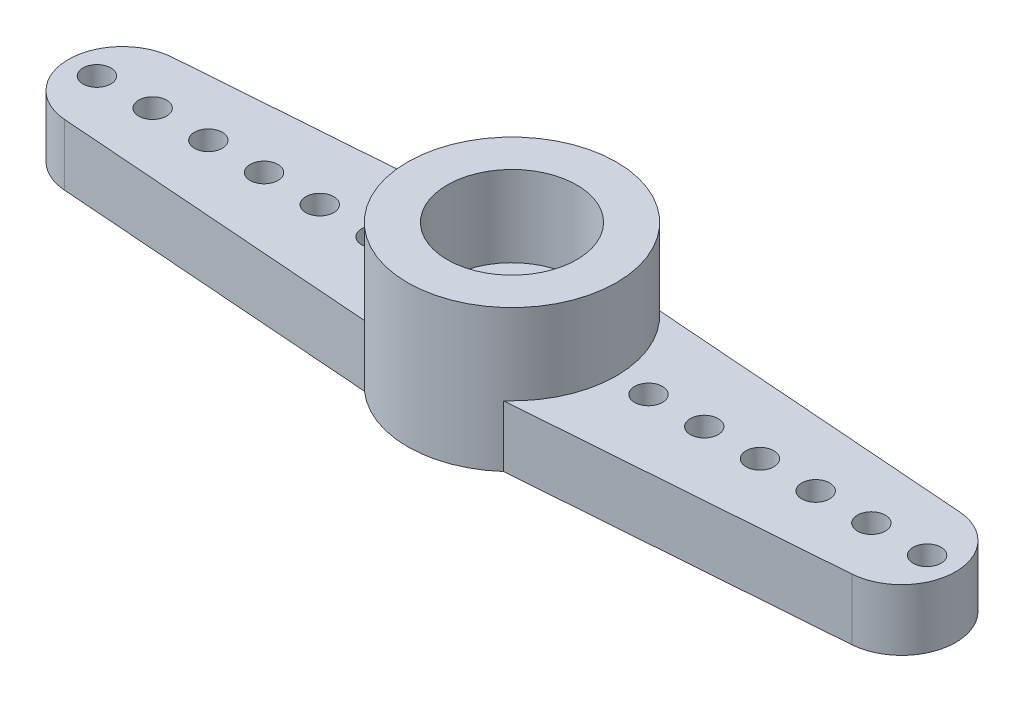
ISO-10303-21;
HEADER;
FILE_DESCRIPTION(('STEP AP214'),'2;1');
FILE_NAME('part.step','',(''),(''),'','','');
FILE_SCHEMA(('AUTOMOTIVE_DESIGN { 1 0 10303 214 1 1 1 1 }'));
ENDSEC;
DATA;
#1=APPLICATION_CONTEXT('core data for automotive mechanical design processes');
#2=APPLICATION_PROTOCOL_DEFINITION('international standard','automotive_design',2000,#1);
#3=PRODUCT_CONTEXT('',#1,'mechanical');
#4=PRODUCT('Part','Part','',(#3));
#5=PRODUCT_RELATED_PRODUCT_CATEGORY('part','',(#4));
#6=PRODUCT_DEFINITION_FORMATION('','',#4);
#7=PRODUCT_DEFINITION_CONTEXT('part definition',#1,'design');
#8=PRODUCT_DEFINITION('design','',#6,#7);
#9=PRODUCT_DEFINITION_SHAPE('','',#8);
#10=(LENGTH_UNIT() NAMED_UNIT(*) SI_UNIT(.MILLI.,.METRE.));
#11=(NAMED_UNIT(*) PLANE_ANGLE_UNIT() SI_UNIT($,.RADIAN.));
#12=(NAMED_UNIT(*) SI_UNIT($,.STERADIAN.) SOLID_ANGLE_UNIT());
#13=UNCERTAINTY_MEASURE_WITH_UNIT(LENGTH_MEASURE(1.E-05),#10,'distance_accuracy_value','');
#14=(GEOMETRIC_REPRESENTATION_CONTEXT(3) GLOBAL_UNCERTAINTY_ASSIGNED_CONTEXT((#13)) GLOBAL_UNIT_ASSIGNED_CONTEXT((#10,
#11,#12)) REPRESENTATION_CONTEXT('',''));
#15=CARTESIAN_POINT('',(0.,0.,0.));
#16=DIRECTION('',(0.,0.,1.));
#17=DIRECTION('',(1.,0.,0.));
#18=AXIS2_PLACEMENT_3D('',#15,#16,#17);
#19=CARTESIAN_POINT('',(0.,2.2,0.));
#20=DIRECTION('',(0.,-1.,0.));
#21=DIRECTION('',(0.,0.,-1.));
#22=AXIS2_PLACEMENT_3D('',#19,#20,#21);
#23=CYLINDRICAL_SURFACE('',#22,1.5);
#24=CARTESIAN_POINT('',(0.,2.2,0.));
#25=DIRECTION('',(0.,1.,0.));
#26=DIRECTION('',(0.,0.,1.));
#27=AXIS2_PLACEMENT_3D('',#24,#25,#26);
#28=CIRCLE('',#27,1.5);
#29=CARTESIAN_POINT('',(0.,2.2,1.5));
#30=VERTEX_POINT('',#29);
#31=EDGE_CURVE('E136',#30,#30,#28,.T.);
#32=ORIENTED_EDGE('',*,*,#31,.T.);
#33=EDGE_LOOP('',(#32));
#34=FACE_BOUND('',#33,.T.);
#35=CARTESIAN_POINT('',(0.,0.8,0.));
#36=DIRECTION('',(0.,-1.,0.));
#37=DIRECTION('',(0.,0.,-1.));
#38=AXIS2_PLACEMENT_3D('',#35,#36,#37);
#39=CIRCLE('',#38,1.5);
#40=CARTESIAN_POINT('',(0.,0.8,-1.5));
#41=VERTEX_POINT('',#40);
#42=EDGE_CURVE('E42',#41,#41,#39,.T.);
#43=ORIENTED_EDGE('',*,*,#42,.T.);
#44=EDGE_LOOP('',(#43));
#45=FACE_BOUND('',#44,.T.);
#46=ADVANCED_FACE('F35',(#34,#45),#23,.F.);
#47=CARTESIAN_POINT('',(14.1314068018781,2.42,-1.93230912585367));
#48=CARTESIAN_POINT('',(14.1314068018781,2.3466666666666,-1.93230912585367));
#49=CARTESIAN_POINT('',(14.1314068018783,2.27333333333342,-1.93230912585365));
#50=CARTESIAN_POINT('',(14.1314068018762,1.46666666666577,-1.93230912585381));
#51=CARTESIAN_POINT('',(14.1314068018781,0.733333333333381,-1.93230912585367));
#52=CARTESIAN_POINT('',(14.1314068018781,-0.0733333333333382,-1.93230912585367));
#53=CARTESIAN_POINT('',(14.1314068018781,-0.146666666666661,-1.93230912585367));
#54=CARTESIAN_POINT('',(14.1314068018781,-0.22,-1.93230912585367));
#55=CARTESIAN_POINT('',(17.4863916285294,2.42,-1.68214916068935));
#56=CARTESIAN_POINT('',(17.4863916285294,2.34666666666683,-1.68214916068935));
#57=CARTESIAN_POINT('',(17.4863916285292,2.27333333333312,-1.68214916068915));
#58=CARTESIAN_POINT('',(17.486391628532,1.4666666666688,-1.68214916069142));
#59=CARTESIAN_POINT('',(17.4863916285294,0.733333333333381,-1.68214916068935));
#60=CARTESIAN_POINT('',(17.4863916285294,-0.0733333333333382,-1.68214916068935));
#61=CARTESIAN_POINT('',(17.4863916285294,-0.146666666666661,-1.68214916068935));
#62=CARTESIAN_POINT('',(17.4863916285294,-0.22,-1.68214916068935));
#63=CARTESIAN_POINT('',(17.4863916285294,2.42,1.68214916068935));
#64=CARTESIAN_POINT('',(17.4863916285294,2.34666666666683,1.68214916068935));
#65=CARTESIAN_POINT('',(17.4863916285292,2.27333333333312,1.68214916068916));
#66=CARTESIAN_POINT('',(17.486391628532,1.4666666666688,1.68214916069134));
#67=CARTESIAN_POINT('',(17.4863916285294,0.733333333333381,1.68214916068935));
#68=CARTESIAN_POINT('',(17.4863916285294,-0.0733333333333382,1.68214916068935));
#69=CARTESIAN_POINT('',(17.4863916285294,-0.146666666666661,1.68214916068935));
#70=CARTESIAN_POINT('',(17.4863916285294,-0.22,1.68214916068935));
#71=CARTESIAN_POINT('',(14.1314068018781,2.42,1.93230912585367));
#72=CARTESIAN_POINT('',(14.1314068018781,2.3466666666666,1.93230912585367));
#73=CARTESIAN_POINT('',(14.1314068018783,2.27333333333342,1.93230912585365));
#74=CARTESIAN_POINT('',(14.1314068018762,1.46666666666577,1.93230912585381));
#75=CARTESIAN_POINT('',(14.1314068018781,0.733333333333381,1.93230912585367));
#76=CARTESIAN_POINT('',(14.1314068018781,-0.0733333333333382,1.93230912585367));
#77=CARTESIAN_POINT('',(14.1314068018781,-0.146666666666661,1.93230912585367));
#78=CARTESIAN_POINT('',(14.1314068018781,-0.22,1.93230912585367));
#79=(BOUNDED_SURFACE() B_SPLINE_SURFACE(3,3,((#47,#48,#49,#50,#51,#52,#53,#54),(#55,#56,#57,#58,
#59,#60,#61,#62),(#63,#64,#65,#66,#67,#68,#69,#70),(#71,#72,#73,#74,#75,#76,#77,#78)),
.UNSPECIFIED.,.F.,.F.,.F.) B_SPLINE_SURFACE_WITH_KNOTS((4,4),(4,2,2,4),(0.,1.),(-0.1,0.,1.,1.1),
.UNSPECIFIED.) GEOMETRIC_REPRESENTATION_ITEM() RATIONAL_B_SPLINE_SURFACE(((1.,1.,1.,1.,1.,1.,1.,
1.),(0.382904832106128,0.382904832106128,0.382904832106128,0.382904832106128,0.382904832106128,
0.382904832106128,0.382904832106128,0.382904832106128),(0.382904832106128,0.382904832106128,
0.382904832106128,0.382904832106128,0.382904832106128,0.382904832106128,0.382904832106128,
0.382904832106128),(1.,1.,1.,1.,1.,1.,1.,1.))) REPRESENTATION_ITEM('') SURFACE());
#80=CARTESIAN_POINT('',(14.1314068018781,-0.22,-1.93230912585367));
#81=CARTESIAN_POINT('',(14.1314068018781,-0.146666666666661,-1.93230912585367));
#82=CARTESIAN_POINT('',(14.1314068018781,-0.0733333333333382,-1.93230912585367));
#83=CARTESIAN_POINT('',(14.1314068018781,0.733333333333381,-1.93230912585367));
#84=CARTESIAN_POINT('',(14.1314068018762,1.46666666666577,-1.93230912585381));
#85=CARTESIAN_POINT('',(14.1314068018783,2.27333333333342,-1.93230912585365));
#86=CARTESIAN_POINT('',(14.1314068018781,2.3466666666666,-1.93230912585367));
#87=CARTESIAN_POINT('',(14.1314068018781,2.42,-1.93230912585367));
#88=(BOUNDED_CURVE() B_SPLINE_CURVE(3,(#80,#81,#82,#83,#84,#85,#86,#87),.UNSPECIFIED.,.F.,
.F.) B_SPLINE_CURVE_WITH_KNOTS((4,2,2,4),(-0.1,0.,1.,1.1),
.UNSPECIFIED.) CURVE() GEOMETRIC_REPRESENTATION_ITEM() RATIONAL_B_SPLINE_CURVE((1.,1.,1.,1.,1.,
1.,1.,1.)) REPRESENTATION_ITEM(''));
#89=CARTESIAN_POINT('',(14.1314068018781,2.2,-1.93230912585367));
#90=VERTEX_POINT('',#89);
#91=CARTESIAN_POINT('',(14.1314068018781,0.,-1.93230912585367));
#92=VERTEX_POINT('',#91);
#93=EDGE_CURVE('E275',#90,#92,#88,.F.);
#94=CARTESIAN_POINT('',(14.1314068018781,2.2,-1.93230912585367));
#95=CARTESIAN_POINT('',(17.4863916285294,2.2,-1.68214916068935));
#96=CARTESIAN_POINT('',(17.4863916285294,2.2,1.68214916068936));
#97=CARTESIAN_POINT('',(14.1314068018781,2.2,1.93230912585367));
#98=(BOUNDED_CURVE() B_SPLINE_CURVE(3,(#94,#95,#96,#97),.UNSPECIFIED.,.F.,
.F.) B_SPLINE_CURVE_WITH_KNOTS((4,4),(0.,1.),
.UNSPECIFIED.) CURVE() GEOMETRIC_REPRESENTATION_ITEM() RATIONAL_B_SPLINE_CURVE((1.,
0.382904832106128,0.382904832106128,1.)) REPRESENTATION_ITEM(''));
#99=CARTESIAN_POINT('',(14.1314068018781,2.2,1.93230912585367));
#100=VERTEX_POINT('',#99);
#101=EDGE_CURVE('E47',#100,#90,#98,.F.);
#102=CARTESIAN_POINT('',(14.1314068018781,2.42,1.93230912585367));
#103=CARTESIAN_POINT('',(14.1314068018781,2.3466666666666,1.93230912585367));
#104=CARTESIAN_POINT('',(14.1314068018783,2.27333333333342,1.93230912585365));
#105=CARTESIAN_POINT('',(14.1314068018762,1.46666666666577,1.93230912585381));
#106=CARTESIAN_POINT('',(14.1314068018781,0.733333333333381,1.93230912585367));
#107=CARTESIAN_POINT('',(14.1314068018781,-0.0733333333333382,1.93230912585367));
#108=CARTESIAN_POINT('',(14.1314068018781,-0.146666666666661,1.93230912585367));
#109=CARTESIAN_POINT('',(14.1314068018781,-0.22,1.93230912585367));
#110=(BOUNDED_CURVE() B_SPLINE_CURVE(3,(#102,#103,#104,#105,#106,#107,#108,#109),.UNSPECIFIED.,
.F.,.F.) B_SPLINE_CURVE_WITH_KNOTS((4,2,2,4),(-0.1,0.,1.,1.1),
.UNSPECIFIED.) CURVE() GEOMETRIC_REPRESENTATION_ITEM() RATIONAL_B_SPLINE_CURVE((1.,1.,1.,1.,1.,
1.,1.,1.)) REPRESENTATION_ITEM(''));
#111=CARTESIAN_POINT('',(14.1314068018781,0.,1.93230912585367));
#112=VERTEX_POINT('',#111);
#113=EDGE_CURVE('E109',#112,#100,#110,.F.);
#114=CARTESIAN_POINT('',(14.1314068018781,0.,1.93230912585367));
#115=CARTESIAN_POINT('',(17.4863916285294,0.,1.68214916068935));
#116=CARTESIAN_POINT('',(17.4863916285294,0.,-1.68214916068935));
#117=CARTESIAN_POINT('',(14.1314068018781,0.,-1.93230912585367));
#118=(BOUNDED_CURVE() B_SPLINE_CURVE(3,(#114,#115,#116,#117),.UNSPECIFIED.,.F.,
.F.) B_SPLINE_CURVE_WITH_KNOTS((4,4),(0.,1.),
.UNSPECIFIED.) CURVE() GEOMETRIC_REPRESENTATION_ITEM() RATIONAL_B_SPLINE_CURVE((1.,
0.382904832106128,0.382904832106128,1.)) REPRESENTATION_ITEM(''));
#119=EDGE_CURVE('E11',#92,#112,#118,.F.);
#120=ORIENTED_EDGE('',*,*,#93,.F.);
#121=ORIENTED_EDGE('',*,*,#101,.F.);
#122=ORIENTED_EDGE('',*,*,#113,.F.);
#123=ORIENTED_EDGE('',*,*,#119,.F.);
#124=EDGE_LOOP('',(#120,#121,#122,#123));
#125=FACE_BOUND('',#124,.T.);
#126=ADVANCED_FACE('F37',(#125),#79,.T.);
#127=CARTESIAN_POINT('',(-14.1314068018781,2.42,1.93230912585367));
#128=CARTESIAN_POINT('',(-14.1314068018781,2.3466666666666,1.93230912585367));
#129=CARTESIAN_POINT('',(-14.1314068018783,2.27333333333342,1.93230912585365));
#130=CARTESIAN_POINT('',(-14.1314068018762,1.46666666666577,1.93230912585381));
#131=CARTESIAN_POINT('',(-14.1314068018781,0.733333333333381,1.93230912585367));
#132=CARTESIAN_POINT('',(-14.1314068018781,-0.0733333333333382,1.93230912585367));
#133=CARTESIAN_POINT('',(-14.1314068018781,-0.146666666666661,1.93230912585367));
#134=CARTESIAN_POINT('',(-14.1314068018781,-0.22,1.93230912585367));
#135=CARTESIAN_POINT('',(-17.4863916285294,2.42,1.68214916068935));
#136=CARTESIAN_POINT('',(-17.4863916285294,2.34666666666683,1.68214916068935));
#137=CARTESIAN_POINT('',(-17.4863916285292,2.27333333333312,1.68214916068916));
#138=CARTESIAN_POINT('',(-17.486391628532,1.4666666666688,1.68214916069134));
#139=CARTESIAN_POINT('',(-17.4863916285294,0.733333333333381,1.68214916068935));
#140=CARTESIAN_POINT('',(-17.4863916285294,-0.0733333333333382,1.68214916068935));
#141=CARTESIAN_POINT('',(-17.4863916285294,-0.146666666666661,1.68214916068935));
#142=CARTESIAN_POINT('',(-17.4863916285294,-0.22,1.68214916068935));
#143=CARTESIAN_POINT('',(-17.4863916285294,2.42,-1.68214916068935));
#144=CARTESIAN_POINT('',(-17.4863916285294,2.34666666666683,-1.68214916068935));
#145=CARTESIAN_POINT('',(-17.486391628529,2.27333333333312,-1.68214916068916));
#146=CARTESIAN_POINT('',(-17.4863916285332,1.4666666666688,-1.68214916069134));
#147=CARTESIAN_POINT('',(-17.4863916285294,0.733333333333381,-1.68214916068935));
#148=CARTESIAN_POINT('',(-17.4863916285294,-0.0733333333333382,-1.68214916068935));
#149=CARTESIAN_POINT('',(-17.4863916285294,-0.146666666666661,-1.68214916068935));
#150=CARTESIAN_POINT('',(-17.4863916285294,-0.22,-1.68214916068935));
#151=CARTESIAN_POINT('',(-14.1314068018781,2.42,-1.93230912585367));
#152=CARTESIAN_POINT('',(-14.1314068018781,2.3466666666666,-1.93230912585367));
#153=CARTESIAN_POINT('',(-14.1314068018783,2.27333333333342,-1.93230912585365));
#154=CARTESIAN_POINT('',(-14.1314068018762,1.46666666666577,-1.93230912585381));
#155=CARTESIAN_POINT('',(-14.1314068018781,0.733333333333381,-1.93230912585367));
#156=CARTESIAN_POINT('',(-14.1314068018781,-0.0733333333333382,-1.93230912585367));
#157=CARTESIAN_POINT('',(-14.1314068018781,-0.146666666666661,-1.93230912585367));
#158=CARTESIAN_POINT('',(-14.1314068018781,-0.22,-1.93230912585367));
#159=(BOUNDED_SURFACE() B_SPLINE_SURFACE(3,3,((#127,#128,#129,#130,#131,#132,#133,#134),(#135,
#136,#137,#138,#139,#140,#141,#142),(#143,#144,#145,#146,#147,#148,#149,#150),(#151,#152,#153,
#154,#155,#156,#157,#158)),.UNSPECIFIED.,.F.,.F.,.F.) B_SPLINE_SURFACE_WITH_KNOTS((4,4),(4,2,2,
4),(0.,1.),(-0.1,0.,1.,1.1),
.UNSPECIFIED.) GEOMETRIC_REPRESENTATION_ITEM() RATIONAL_B_SPLINE_SURFACE(((1.,1.,1.,1.,1.,1.,1.,
1.),(0.382904832106128,0.382904832106128,0.382904832106128,0.382904832106128,0.382904832106128,
0.382904832106128,0.382904832106128,0.382904832106128),(0.382904832106128,0.382904832106128,
0.382904832106128,0.382904832106128,0.382904832106128,0.382904832106128,0.382904832106128,
0.382904832106128),(1.,1.,1.,1.,1.,1.,1.,1.))) REPRESENTATION_ITEM('') SURFACE());
#160=CARTESIAN_POINT('',(-14.1314068018781,2.42,-1.93230912585367));
#161=CARTESIAN_POINT('',(-14.1314068018781,2.3466666666666,-1.93230912585367));
#162=CARTESIAN_POINT('',(-14.1314068018783,2.27333333333342,-1.93230912585365));
#163=CARTESIAN_POINT('',(-14.1314068018762,1.46666666666577,-1.93230912585381));
#164=CARTESIAN_POINT('',(-14.1314068018781,0.733333333333381,-1.93230912585367));
#165=CARTESIAN_POINT('',(-14.1314068018781,-0.0733333333333382,-1.93230912585367));
#166=CARTESIAN_POINT('',(-14.1314068018781,-0.146666666666661,-1.93230912585367));
#167=CARTESIAN_POINT('',(-14.1314068018781,-0.22,-1.93230912585367));
#168=(BOUNDED_CURVE() B_SPLINE_CURVE(3,(#160,#161,#162,#163,#164,#165,#166,#167),.UNSPECIFIED.,
.F.,.F.) B_SPLINE_CURVE_WITH_KNOTS((4,2,2,4),(-0.1,0.,1.,1.1),
.UNSPECIFIED.) CURVE() GEOMETRIC_REPRESENTATION_ITEM() RATIONAL_B_SPLINE_CURVE((1.,1.,1.,1.,1.,
1.,1.,1.)) REPRESENTATION_ITEM(''));
#169=CARTESIAN_POINT('',(-14.1314068018781,0.,-1.93230912585367));
#170=VERTEX_POINT('',#169);
#171=CARTESIAN_POINT('',(-14.1314068018781,2.2,-1.93230912585367));
#172=VERTEX_POINT('',#171);
#173=EDGE_CURVE('E156',#170,#172,#168,.F.);
#174=CARTESIAN_POINT('',(-14.1314068018781,0.,-1.93230912585367));
#175=CARTESIAN_POINT('',(-17.4863916285294,0.,-1.68214916068935));
#176=CARTESIAN_POINT('',(-17.4863916285294,0.,1.68214916068935));
#177=CARTESIAN_POINT('',(-14.1314068018781,0.,1.93230912585367));
#178=(BOUNDED_CURVE() B_SPLINE_CURVE(3,(#174,#175,#176,#177),.UNSPECIFIED.,.F.,
.F.) B_SPLINE_CURVE_WITH_KNOTS((4,4),(0.,1.),
.UNSPECIFIED.) CURVE() GEOMETRIC_REPRESENTATION_ITEM() RATIONAL_B_SPLINE_CURVE((1.,
0.382904832106128,0.382904832106128,1.)) REPRESENTATION_ITEM(''));
#179=CARTESIAN_POINT('',(-14.1314068018781,0.,1.93230912585367));
#180=VERTEX_POINT('',#179);
#181=EDGE_CURVE('E483',#180,#170,#178,.F.);
#182=CARTESIAN_POINT('',(-14.1314068018781,-0.22,1.93230912585367));
#183=CARTESIAN_POINT('',(-14.1314068018781,-0.146666666666661,1.93230912585367));
#184=CARTESIAN_POINT('',(-14.1314068018781,-0.0733333333333382,1.93230912585367));
#185=CARTESIAN_POINT('',(-14.1314068018781,0.733333333333381,1.93230912585367));
#186=CARTESIAN_POINT('',(-14.1314068018762,1.46666666666577,1.93230912585381));
#187=CARTESIAN_POINT('',(-14.1314068018783,2.27333333333342,1.93230912585365));
#188=CARTESIAN_POINT('',(-14.1314068018781,2.3466666666666,1.93230912585367));
#189=CARTESIAN_POINT('',(-14.1314068018781,2.42,1.93230912585367));
#190=(BOUNDED_CURVE() B_SPLINE_CURVE(3,(#182,#183,#184,#185,#186,#187,#188,#189),.UNSPECIFIED.,
.F.,.F.) B_SPLINE_CURVE_WITH_KNOTS((4,2,2,4),(-0.1,0.,1.,1.1),
.UNSPECIFIED.) CURVE() GEOMETRIC_REPRESENTATION_ITEM() RATIONAL_B_SPLINE_CURVE((1.,1.,1.,1.,1.,
1.,1.,1.)) REPRESENTATION_ITEM(''));
#191=CARTESIAN_POINT('',(-14.1314068018781,2.2,1.93230912585367));
#192=VERTEX_POINT('',#191);
#193=EDGE_CURVE('E174',#192,#180,#190,.F.);
#194=CARTESIAN_POINT('',(-14.1314068018781,2.2,1.93230912585367));
#195=CARTESIAN_POINT('',(-17.4863916285294,2.2,1.68214916068935));
#196=CARTESIAN_POINT('',(-17.4863916285294,2.2,-1.68214916068935));
#197=CARTESIAN_POINT('',(-14.1314068018781,2.2,-1.93230912585367));
#198=(BOUNDED_CURVE() B_SPLINE_CURVE(3,(#194,#195,#196,#197),.UNSPECIFIED.,.F.,
.F.) B_SPLINE_CURVE_WITH_KNOTS((4,4),(0.,1.),
.UNSPECIFIED.) CURVE() GEOMETRIC_REPRESENTATION_ITEM() RATIONAL_B_SPLINE_CURVE((1.,
0.382904832106128,0.382904832106128,1.)) REPRESENTATION_ITEM(''));
#199=EDGE_CURVE('E308',#172,#192,#198,.F.);
#200=ORIENTED_EDGE('',*,*,#173,.F.);
#201=ORIENTED_EDGE('',*,*,#181,.F.);
#202=ORIENTED_EDGE('',*,*,#193,.F.);
#203=ORIENTED_EDGE('',*,*,#199,.F.);
#204=EDGE_LOOP('',(#200,#201,#202,#203));
#205=FACE_BOUND('',#204,.T.);
#206=ADVANCED_FACE('F197',(#205),#159,.T.);
#207=CARTESIAN_POINT('',(0.,2.2,0.));
#208=DIRECTION('',(0.,1.,0.));
#209=DIRECTION('',(0.,0.,1.));
#210=AXIS2_PLACEMENT_3D('',#207,#208,#209);
#211=PLANE('',#210);
#212=DIRECTION('',(0.997231667992043,0.,-0.0743572481591926));
#213=VECTOR('',#212,1.);
#214=CARTESIAN_POINT('',(2.49449393665328,2.2,2.8));
#215=LINE('',#214,#213);
#216=CARTESIAN_POINT('',(2.49449393665328,2.2,2.8));
#217=VERTEX_POINT('',#216);
#218=EDGE_CURVE('E104',#217,#100,#215,.T.);
#219=ORIENTED_EDGE('',*,*,#218,.T.);
#220=ORIENTED_EDGE('',*,*,#101,.T.);
#221=DIRECTION('',(-0.997231667992043,0.,-0.0743572481591926));
#222=VECTOR('',#221,1.);
#223=CARTESIAN_POINT('',(2.49449393665328,2.2,-2.8));
#224=LINE('',#223,#222);
#225=CARTESIAN_POINT('',(2.49449393665328,2.2,-2.8));
#226=VERTEX_POINT('',#225);
#227=EDGE_CURVE('E113',#90,#226,#224,.T.);
#228=ORIENTED_EDGE('',*,*,#227,.T.);
#229=CARTESIAN_POINT('',(0.,2.2,0.));
#230=DIRECTION('',(0.,1.,0.));
#231=DIRECTION('',(0.,0.,1.));
#232=AXIS2_PLACEMENT_3D('',#229,#230,#231);
#233=CIRCLE('',#232,3.75);
#234=EDGE_CURVE('E121',#217,#226,#233,.T.);
#235=ORIENTED_EDGE('',*,*,#234,.F.);
#236=EDGE_LOOP('',(#219,#220,#228,#235));
#237=FACE_BOUND('',#236,.T.);
#238=CARTESIAN_POINT('',(12.9,2.2,0.));
#239=DIRECTION('',(0.,1.,0.));
#240=DIRECTION('',(0.,0.,1.));
#241=AXIS2_PLACEMENT_3D('',#238,#239,#240);
#242=CIRCLE('',#241,0.500000000000001);
#243=CARTESIAN_POINT('',(12.9,2.2,0.500000000000001));
#244=VERTEX_POINT('',#243);
#245=EDGE_CURVE('E350',#244,#244,#242,.T.);
#246=ORIENTED_EDGE('',*,*,#245,.F.);
#247=EDGE_LOOP('',(#246));
#248=FACE_BOUND('',#247,.T.);
#249=CARTESIAN_POINT('',(8.9,2.2,0.));
#250=DIRECTION('',(0.,1.,0.));
#251=DIRECTION('',(0.,0.,1.));
#252=AXIS2_PLACEMENT_3D('',#249,#250,#251);
#253=CIRCLE('',#252,0.500000000000001);
#254=CARTESIAN_POINT('',(8.9,2.2,0.500000000000001));
#255=VERTEX_POINT('',#254);
#256=EDGE_CURVE('E338',#255,#255,#253,.T.);
#257=ORIENTED_EDGE('',*,*,#256,.F.);
#258=EDGE_LOOP('',(#257));
#259=FACE_BOUND('',#258,.T.);
#260=CARTESIAN_POINT('',(4.9,2.2,0.));
#261=DIRECTION('',(0.,1.,0.));
#262=DIRECTION('',(0.,0.,1.));
#263=AXIS2_PLACEMENT_3D('',#260,#261,#262);
#264=CIRCLE('',#263,0.500000000000001);
#265=CARTESIAN_POINT('',(4.9,2.2,0.500000000000001));
#266=VERTEX_POINT('',#265);
#267=EDGE_CURVE('E326',#266,#266,#264,.T.);
#268=ORIENTED_EDGE('',*,*,#267,.F.);
#269=EDGE_LOOP('',(#268));
#270=FACE_BOUND('',#269,.T.);
#271=CARTESIAN_POINT('',(6.9,2.2,0.));
#272=DIRECTION('',(0.,1.,0.));
#273=DIRECTION('',(0.,0.,1.));
#274=AXIS2_PLACEMENT_3D('',#271,#272,#273);
#275=CIRCLE('',#274,0.500000000000001);
#276=CARTESIAN_POINT('',(6.9,2.2,0.500000000000001));
#277=VERTEX_POINT('',#276);
#278=EDGE_CURVE('E333',#277,#277,#275,.T.);
#279=ORIENTED_EDGE('',*,*,#278,.F.);
#280=EDGE_LOOP('',(#279));
#281=FACE_BOUND('',#280,.T.);
#282=CARTESIAN_POINT('',(10.9,2.2,0.));
#283=DIRECTION('',(0.,1.,0.));
#284=DIRECTION('',(0.,0.,1.));
#285=AXIS2_PLACEMENT_3D('',#282,#283,#284);
#286=CIRCLE('',#285,0.500000000000001);
#287=CARTESIAN_POINT('',(10.9,2.2,0.500000000000001));
#288=VERTEX_POINT('',#287);
#289=EDGE_CURVE('E344',#288,#288,#286,.T.);
#290=ORIENTED_EDGE('',*,*,#289,.F.);
#291=EDGE_LOOP('',(#290));
#292=FACE_BOUND('',#291,.T.);
#293=CARTESIAN_POINT('',(14.9,2.2,0.));
#294=DIRECTION('',(0.,1.,0.));
#295=DIRECTION('',(0.,0.,1.));
#296=AXIS2_PLACEMENT_3D('',#293,#294,#295);
#297=CIRCLE('',#296,0.500000000000001);
#298=CARTESIAN_POINT('',(14.9,2.2,0.500000000000001));
#299=VERTEX_POINT('',#298);
#300=EDGE_CURVE('E356',#299,#299,#297,.T.);
#301=ORIENTED_EDGE('',*,*,#300,.F.);
#302=EDGE_LOOP('',(#301));
#303=FACE_BOUND('',#302,.T.);
#304=ADVANCED_FACE('F128',(#237,#248,#259,#270,#281,#292,#303),#211,.T.);
#305=ORIENTED_EDGE('',*,*,#31,.F.);
#306=EDGE_LOOP('',(#305));
#307=FACE_BOUND('',#306,.T.);
#308=CARTESIAN_POINT('',(0.,2.2,0.));
#309=DIRECTION('',(0.,1.,0.));
#310=DIRECTION('',(0.,0.,1.));
#311=AXIS2_PLACEMENT_3D('',#308,#309,#310);
#312=CIRCLE('',#311,2.325);
#313=CARTESIAN_POINT('',(0.,2.2,2.325));
#314=VERTEX_POINT('',#313);
#315=EDGE_CURVE('E139',#314,#314,#312,.T.);
#316=ORIENTED_EDGE('',*,*,#315,.T.);
#317=EDGE_LOOP('',(#316));
#318=FACE_BOUND('',#317,.T.);
#319=ADVANCED_FACE('F405',(#307,#318),#211,.T.);
#320=DIRECTION('',(-0.997231667992043,0.,0.0743572481591926));
#321=VECTOR('',#320,1.);
#322=CARTESIAN_POINT('',(-2.49449393665328,2.2,-2.8));
#323=LINE('',#322,#321);
#324=CARTESIAN_POINT('',(-2.49449393665328,2.2,-2.8));
#325=VERTEX_POINT('',#324);
#326=EDGE_CURVE('E165',#325,#172,#323,.T.);
#327=ORIENTED_EDGE('',*,*,#326,.T.);
#328=ORIENTED_EDGE('',*,*,#199,.T.);
#329=DIRECTION('',(0.997231667992043,0.,0.0743572481591926));
#330=VECTOR('',#329,1.);
#331=CARTESIAN_POINT('',(-2.49449393665328,2.2,2.8));
#332=LINE('',#331,#330);
#333=CARTESIAN_POINT('',(-2.49449393665328,2.2,2.8));
#334=VERTEX_POINT('',#333);
#335=EDGE_CURVE('E114',#192,#334,#332,.T.);
#336=ORIENTED_EDGE('',*,*,#335,.T.);
#337=EDGE_CURVE('E152',#325,#334,#233,.T.);
#338=ORIENTED_EDGE('',*,*,#337,.F.);
#339=EDGE_LOOP('',(#327,#328,#336,#338));
#340=FACE_BOUND('',#339,.T.);
#341=CARTESIAN_POINT('',(-4.9,2.2,0.));
#342=DIRECTION('',(0.,1.,0.));
#343=DIRECTION('',(0.,0.,-1.));
#344=AXIS2_PLACEMENT_3D('',#341,#342,#343);
#345=CIRCLE('',#344,0.500000000000001);
#346=CARTESIAN_POINT('',(-4.9,2.2,-0.500000000000001));
#347=VERTEX_POINT('',#346);
#348=EDGE_CURVE('E392',#347,#347,#345,.T.);
#349=ORIENTED_EDGE('',*,*,#348,.F.);
#350=EDGE_LOOP('',(#349));
#351=FACE_BOUND('',#350,.T.);
#352=CARTESIAN_POINT('',(-8.9,2.2,0.));
#353=DIRECTION('',(0.,1.,0.));
#354=DIRECTION('',(0.,0.,-1.));
#355=AXIS2_PLACEMENT_3D('',#352,#353,#354);
#356=CIRCLE('',#355,0.500000000000001);
#357=CARTESIAN_POINT('',(-8.9,2.2,-0.500000000000001));
#358=VERTEX_POINT('',#357);
#359=EDGE_CURVE('E380',#358,#358,#356,.T.);
#360=ORIENTED_EDGE('',*,*,#359,.F.);
#361=EDGE_LOOP('',(#360));
#362=FACE_BOUND('',#361,.T.);
#363=CARTESIAN_POINT('',(-12.9,2.2,0.));
#364=DIRECTION('',(0.,1.,0.));
#365=DIRECTION('',(0.,0.,-1.));
#366=AXIS2_PLACEMENT_3D('',#363,#364,#365);
#367=CIRCLE('',#366,0.500000000000001);
#368=CARTESIAN_POINT('',(-12.9,2.2,-0.500000000000001));
#369=VERTEX_POINT('',#368);
#370=EDGE_CURVE('E368',#369,#369,#367,.T.);
#371=ORIENTED_EDGE('',*,*,#370,.F.);
#372=EDGE_LOOP('',(#371));
#373=FACE_BOUND('',#372,.T.);
#374=CARTESIAN_POINT('',(-14.9,2.2,0.));
#375=DIRECTION('',(0.,1.,0.));
#376=DIRECTION('',(0.,0.,-1.));
#377=AXIS2_PLACEMENT_3D('',#374,#375,#376);
#378=CIRCLE('',#377,0.500000000000001);
#379=CARTESIAN_POINT('',(-14.9,2.2,-0.500000000000001));
#380=VERTEX_POINT('',#379);
#381=EDGE_CURVE('E362',#380,#380,#378,.T.);
#382=ORIENTED_EDGE('',*,*,#381,.F.);
#383=EDGE_LOOP('',(#382));
#384=FACE_BOUND('',#383,.T.);
#385=CARTESIAN_POINT('',(-10.9,2.2,0.));
#386=DIRECTION('',(0.,1.,0.));
#387=DIRECTION('',(0.,0.,-1.));
#388=AXIS2_PLACEMENT_3D('',#385,#386,#387);
#389=CIRCLE('',#388,0.500000000000001);
#390=CARTESIAN_POINT('',(-10.9,2.2,-0.500000000000001));
#391=VERTEX_POINT('',#390);
#392=EDGE_CURVE('E374',#391,#391,#389,.T.);
#393=ORIENTED_EDGE('',*,*,#392,.F.);
#394=EDGE_LOOP('',(#393));
#395=FACE_BOUND('',#394,.T.);
#396=CARTESIAN_POINT('',(-6.9,2.2,0.));
#397=DIRECTION('',(0.,1.,0.));
#398=DIRECTION('',(0.,0.,-1.));
#399=AXIS2_PLACEMENT_3D('',#396,#397,#398);
#400=CIRCLE('',#399,0.500000000000001);
#401=CARTESIAN_POINT('',(-6.9,2.2,-0.500000000000001));
#402=VERTEX_POINT('',#401);
#403=EDGE_CURVE('E386',#402,#402,#400,.T.);
#404=ORIENTED_EDGE('',*,*,#403,.F.);
#405=EDGE_LOOP('',(#404));
#406=FACE_BOUND('',#405,.T.);
#407=ADVANCED_FACE('F256',(#340,#351,#362,#373,#384,#395,#406),#211,.T.);
#408=CARTESIAN_POINT('',(0.,0.,0.));
#409=DIRECTION('',(0.,1.,0.));
#410=DIRECTION('',(0.,0.,1.));
#411=AXIS2_PLACEMENT_3D('',#408,#409,#410);
#412=PLANE('',#411);
#413=CARTESIAN_POINT('',(0.,0.,0.));
#414=DIRECTION('',(0.,-1.,0.));
#415=DIRECTION('',(0.,0.,-1.));
#416=AXIS2_PLACEMENT_3D('',#413,#414,#415);
#417=CIRCLE('',#416,2.45);
#418=CARTESIAN_POINT('',(0.,0.,-2.45));
#419=VERTEX_POINT('',#418);
#420=EDGE_CURVE('E462',#419,#419,#417,.T.);
#421=ORIENTED_EDGE('',*,*,#420,.F.);
#422=EDGE_LOOP('',(#421));
#423=FACE_BOUND('',#422,.T.);
#424=DIRECTION('',(-0.997231667992043,0.,-0.0743572481591926));
#425=VECTOR('',#424,1.);
#426=CARTESIAN_POINT('',(2.49449393665328,0.,-2.8));
#427=LINE('',#426,#425);
#428=CARTESIAN_POINT('',(2.49449393665328,0.,-2.8));
#429=VERTEX_POINT('',#428);
#430=EDGE_CURVE('E230',#92,#429,#427,.T.);
#431=ORIENTED_EDGE('',*,*,#430,.F.);
#432=ORIENTED_EDGE('',*,*,#119,.T.);
#433=DIRECTION('',(0.997231667992043,0.,-0.0743572481591926));
#434=VECTOR('',#433,1.);
#435=CARTESIAN_POINT('',(2.49449393665328,0.,2.8));
#436=LINE('',#435,#434);
#437=CARTESIAN_POINT('',(2.49449393665328,0.,2.8));
#438=VERTEX_POINT('',#437);
#439=EDGE_CURVE('E226',#438,#112,#436,.T.);
#440=ORIENTED_EDGE('',*,*,#439,.F.);
#441=CARTESIAN_POINT('',(0.,0.,0.));
#442=DIRECTION('',(0.,1.,0.));
#443=DIRECTION('',(0.,0.,1.));
#444=AXIS2_PLACEMENT_3D('',#441,#442,#443);
#445=CIRCLE('',#444,3.75);
#446=CARTESIAN_POINT('',(-2.49449393665328,0.,2.8));
#447=VERTEX_POINT('',#446);
#448=EDGE_CURVE('E124',#447,#438,#445,.T.);
#449=ORIENTED_EDGE('',*,*,#448,.F.);
#450=DIRECTION('',(0.997231667992043,0.,0.0743572481591926));
#451=VECTOR('',#450,1.);
#452=CARTESIAN_POINT('',(-2.49449393665328,0.,2.8));
#453=LINE('',#452,#451);
#454=EDGE_CURVE('E166',#180,#447,#453,.T.);
#455=ORIENTED_EDGE('',*,*,#454,.F.);
#456=ORIENTED_EDGE('',*,*,#181,.T.);
#457=DIRECTION('',(-0.997231667992043,0.,0.0743572481591926));
#458=VECTOR('',#457,1.);
#459=CARTESIAN_POINT('',(-2.49449393665328,0.,-2.8));
#460=LINE('',#459,#458);
#461=CARTESIAN_POINT('',(-2.49449393665328,0.,-2.8));
#462=VERTEX_POINT('',#461);
#463=EDGE_CURVE('E215',#462,#170,#460,.T.);
#464=ORIENTED_EDGE('',*,*,#463,.F.);
#465=CARTESIAN_POINT('',(0.,0.,0.));
#466=DIRECTION('',(0.,1.,0.));
#467=DIRECTION('',(0.,0.,1.));
#468=AXIS2_PLACEMENT_3D('',#465,#466,#467);
#469=CIRCLE('',#468,3.75);
#470=EDGE_CURVE('E218',#429,#462,#469,.T.);
#471=ORIENTED_EDGE('',*,*,#470,.F.);
#472=EDGE_LOOP('',(#431,#432,#440,#449,#455,#456,#464,#471));
#473=FACE_BOUND('',#472,.T.);
#474=CARTESIAN_POINT('',(4.9,0.,0.));
#475=DIRECTION('',(0.,1.,0.));
#476=DIRECTION('',(0.,0.,1.));
#477=AXIS2_PLACEMENT_3D('',#474,#475,#476);
#478=CIRCLE('',#477,0.500000000000001);
#479=CARTESIAN_POINT('',(4.9,0.,0.500000000000001));
#480=VERTEX_POINT('',#479);
#481=EDGE_CURVE('E328',#480,#480,#478,.T.);
#482=ORIENTED_EDGE('',*,*,#481,.T.);
#483=EDGE_LOOP('',(#482));
#484=FACE_BOUND('',#483,.T.);
#485=CARTESIAN_POINT('',(6.9,0.,0.));
#486=DIRECTION('',(0.,1.,0.));
#487=DIRECTION('',(0.,0.,1.));
#488=AXIS2_PLACEMENT_3D('',#485,#486,#487);
#489=CIRCLE('',#488,0.500000000000001);
#490=CARTESIAN_POINT('',(6.9,0.,0.500000000000001));
#491=VERTEX_POINT('',#490);
#492=EDGE_CURVE('E335',#491,#491,#489,.T.);
#493=ORIENTED_EDGE('',*,*,#492,.T.);
#494=EDGE_LOOP('',(#493));
#495=FACE_BOUND('',#494,.T.);
#496=CARTESIAN_POINT('',(8.9,0.,0.));
#497=DIRECTION('',(0.,1.,0.));
#498=DIRECTION('',(0.,0.,1.));
#499=AXIS2_PLACEMENT_3D('',#496,#497,#498);
#500=CIRCLE('',#499,0.500000000000001);
#501=CARTESIAN_POINT('',(8.9,0.,0.500000000000001));
#502=VERTEX_POINT('',#501);
#503=EDGE_CURVE('E341',#502,#502,#500,.T.);
#504=ORIENTED_EDGE('',*,*,#503,.T.);
#505=EDGE_LOOP('',(#504));
#506=FACE_BOUND('',#505,.T.);
#507=CARTESIAN_POINT('',(10.9,0.,0.));
#508=DIRECTION('',(0.,1.,0.));
#509=DIRECTION('',(0.,0.,1.));
#510=AXIS2_PLACEMENT_3D('',#507,#508,#509);
#511=CIRCLE('',#510,0.500000000000001);
#512=CARTESIAN_POINT('',(10.9,0.,0.500000000000001));
#513=VERTEX_POINT('',#512);
#514=EDGE_CURVE('E347',#513,#513,#511,.T.);
#515=ORIENTED_EDGE('',*,*,#514,.T.);
#516=EDGE_LOOP('',(#515));
#517=FACE_BOUND('',#516,.T.);
#518=CARTESIAN_POINT('',(12.9,0.,0.));
#519=DIRECTION('',(0.,1.,0.));
#520=DIRECTION('',(0.,0.,1.));
#521=AXIS2_PLACEMENT_3D('',#518,#519,#520);
#522=CIRCLE('',#521,0.500000000000001);
#523=CARTESIAN_POINT('',(12.9,0.,0.500000000000001));
#524=VERTEX_POINT('',#523);
#525=EDGE_CURVE('E353',#524,#524,#522,.T.);
#526=ORIENTED_EDGE('',*,*,#525,.T.);
#527=EDGE_LOOP('',(#526));
#528=FACE_BOUND('',#527,.T.);
#529=CARTESIAN_POINT('',(14.9,0.,0.));
#530=DIRECTION('',(0.,1.,0.));
#531=DIRECTION('',(0.,0.,1.));
#532=AXIS2_PLACEMENT_3D('',#529,#530,#531);
#533=CIRCLE('',#532,0.500000000000001);
#534=CARTESIAN_POINT('',(14.9,0.,0.500000000000001));
#535=VERTEX_POINT('',#534);
#536=EDGE_CURVE('E359',#535,#535,#533,.T.);
#537=ORIENTED_EDGE('',*,*,#536,.T.);
#538=EDGE_LOOP('',(#537));
#539=FACE_BOUND('',#538,.T.);
#540=CARTESIAN_POINT('',(-14.9,0.,0.));
#541=DIRECTION('',(0.,1.,0.));
#542=DIRECTION('',(0.,0.,-1.));
#543=AXIS2_PLACEMENT_3D('',#540,#541,#542);
#544=CIRCLE('',#543,0.500000000000001);
#545=CARTESIAN_POINT('',(-14.9,0.,-0.500000000000001));
#546=VERTEX_POINT('',#545);
#547=EDGE_CURVE('E365',#546,#546,#544,.T.);
#548=ORIENTED_EDGE('',*,*,#547,.T.);
#549=EDGE_LOOP('',(#548));
#550=FACE_BOUND('',#549,.T.);
#551=CARTESIAN_POINT('',(-12.9,0.,0.));
#552=DIRECTION('',(0.,1.,0.));
#553=DIRECTION('',(0.,0.,-1.));
#554=AXIS2_PLACEMENT_3D('',#551,#552,#553);
#555=CIRCLE('',#554,0.500000000000001);
#556=CARTESIAN_POINT('',(-12.9,0.,-0.500000000000001));
#557=VERTEX_POINT('',#556);
#558=EDGE_CURVE('E371',#557,#557,#555,.T.);
#559=ORIENTED_EDGE('',*,*,#558,.T.);
#560=EDGE_LOOP('',(#559));
#561=FACE_BOUND('',#560,.T.);
#562=CARTESIAN_POINT('',(-10.9,0.,0.));
#563=DIRECTION('',(0.,1.,0.));
#564=DIRECTION('',(0.,0.,-1.));
#565=AXIS2_PLACEMENT_3D('',#562,#563,#564);
#566=CIRCLE('',#565,0.500000000000001);
#567=CARTESIAN_POINT('',(-10.9,0.,-0.500000000000001));
#568=VERTEX_POINT('',#567);
#569=EDGE_CURVE('E377',#568,#568,#566,.T.);
#570=ORIENTED_EDGE('',*,*,#569,.T.);
#571=EDGE_LOOP('',(#570));
#572=FACE_BOUND('',#571,.T.);
#573=CARTESIAN_POINT('',(-8.9,0.,0.));
#574=DIRECTION('',(0.,1.,0.));
#575=DIRECTION('',(0.,0.,-1.));
#576=AXIS2_PLACEMENT_3D('',#573,#574,#575);
#577=CIRCLE('',#576,0.500000000000001);
#578=CARTESIAN_POINT('',(-8.9,0.,-0.500000000000001));
#579=VERTEX_POINT('',#578);
#580=EDGE_CURVE('E383',#579,#579,#577,.T.);
#581=ORIENTED_EDGE('',*,*,#580,.T.);
#582=EDGE_LOOP('',(#581));
#583=FACE_BOUND('',#582,.T.);
#584=CARTESIAN_POINT('',(-6.9,0.,0.));
#585=DIRECTION('',(0.,1.,0.));
#586=DIRECTION('',(0.,0.,-1.));
#587=AXIS2_PLACEMENT_3D('',#584,#585,#586);
#588=CIRCLE('',#587,0.500000000000001);
#589=CARTESIAN_POINT('',(-6.9,0.,-0.500000000000001));
#590=VERTEX_POINT('',#589);
#591=EDGE_CURVE('E389',#590,#590,#588,.T.);
#592=ORIENTED_EDGE('',*,*,#591,.T.);
#593=EDGE_LOOP('',(#592));
#594=FACE_BOUND('',#593,.T.);
#595=CARTESIAN_POINT('',(-4.9,0.,0.));
#596=DIRECTION('',(0.,1.,0.));
#597=DIRECTION('',(0.,0.,-1.));
#598=AXIS2_PLACEMENT_3D('',#595,#596,#597);
#599=CIRCLE('',#598,0.500000000000001);
#600=CARTESIAN_POINT('',(-4.9,0.,-0.500000000000001));
#601=VERTEX_POINT('',#600);
#602=EDGE_CURVE('E395',#601,#601,#599,.T.);
#603=ORIENTED_EDGE('',*,*,#602,.T.);
#604=EDGE_LOOP('',(#603));
#605=FACE_BOUND('',#604,.T.);
#606=ADVANCED_FACE('F195',(#423,#473,#484,#495,#506,#517,#528,#539,#550,#561,#572,#583,#594,
#605),#412,.F.);
#607=CARTESIAN_POINT('',(-2.49449393665328,2.2,-2.8));
#608=DIRECTION('',(0.0743572481591926,0.,0.997231667992043));
#609=DIRECTION('',(0.997231667992043,0.,-0.0743572481591926));
#610=AXIS2_PLACEMENT_3D('',#607,#608,#609);
#611=PLANE('',#610);
#612=ORIENTED_EDGE('',*,*,#463,.T.);
#613=ORIENTED_EDGE('',*,*,#173,.T.);
#614=ORIENTED_EDGE('',*,*,#326,.F.);
#615=DIRECTION('',(0.,-1.,0.));
#616=VECTOR('',#615,1.);
#617=CARTESIAN_POINT('',(-2.49449393665328,2.2,-2.8));
#618=LINE('',#617,#616);
#619=EDGE_CURVE('E157',#325,#462,#618,.T.);
#620=ORIENTED_EDGE('',*,*,#619,.T.);
#621=EDGE_LOOP('',(#612,#613,#614,#620));
#622=FACE_BOUND('',#621,.T.);
#623=ADVANCED_FACE('F191',(#622),#611,.F.);
#624=CARTESIAN_POINT('',(-2.49449393665328,2.2,2.8));
#625=DIRECTION('',(0.0743572481591926,0.,-0.997231667992043));
#626=DIRECTION('',(-0.997231667992043,0.,-0.0743572481591926));
#627=AXIS2_PLACEMENT_3D('',#624,#625,#626);
#628=PLANE('',#627);
#629=ORIENTED_EDGE('',*,*,#335,.F.);
#630=ORIENTED_EDGE('',*,*,#193,.T.);
#631=ORIENTED_EDGE('',*,*,#454,.T.);
#632=DIRECTION('',(0.,-1.,0.));
#633=VECTOR('',#632,1.);
#634=CARTESIAN_POINT('',(-2.49449393665328,2.2,2.8));
#635=LINE('',#634,#633);
#636=EDGE_CURVE('E125',#334,#447,#635,.T.);
#637=ORIENTED_EDGE('',*,*,#636,.F.);
#638=EDGE_LOOP('',(#629,#630,#631,#637));
#639=FACE_BOUND('',#638,.T.);
#640=ADVANCED_FACE('F181',(#639),#628,.F.);
#641=CARTESIAN_POINT('',(0.,2.2,0.));
#642=DIRECTION('',(0.,-1.,0.));
#643=DIRECTION('',(0.,0.,-1.));
#644=AXIS2_PLACEMENT_3D('',#641,#642,#643);
#645=CYLINDRICAL_SURFACE('',#644,3.75);
#646=ORIENTED_EDGE('',*,*,#448,.T.);
#647=DIRECTION('',(0.,-1.,0.));
#648=VECTOR('',#647,1.);
#649=CARTESIAN_POINT('',(2.49449393665328,2.2,2.8));
#650=LINE('',#649,#648);
#651=EDGE_CURVE('E108',#217,#438,#650,.T.);
#652=ORIENTED_EDGE('',*,*,#651,.F.);
#653=ORIENTED_EDGE('',*,*,#234,.T.);
#654=DIRECTION('',(0.,-1.,0.));
#655=VECTOR('',#654,1.);
#656=CARTESIAN_POINT('',(2.49449393665328,2.2,-2.8));
#657=LINE('',#656,#655);
#658=EDGE_CURVE('E126',#226,#429,#657,.T.);
#659=ORIENTED_EDGE('',*,*,#658,.T.);
#660=ORIENTED_EDGE('',*,*,#470,.T.);
#661=ORIENTED_EDGE('',*,*,#619,.F.);
#662=ORIENTED_EDGE('',*,*,#337,.T.);
#663=ORIENTED_EDGE('',*,*,#636,.T.);
#664=EDGE_LOOP('',(#646,#652,#653,#659,#660,#661,#662,#663));
#665=FACE_BOUND('',#664,.T.);
#666=CARTESIAN_POINT('',(0.,5.1,0.));
#667=DIRECTION('',(0.,1.,0.));
#668=DIRECTION('',(0.,0.,1.));
#669=AXIS2_PLACEMENT_3D('',#666,#667,#668);
#670=CIRCLE('',#669,3.75);
#671=CARTESIAN_POINT('',(0.,5.1,3.75));
#672=VERTEX_POINT('',#671);
#673=EDGE_CURVE('E132',#672,#672,#670,.T.);
#674=ORIENTED_EDGE('',*,*,#673,.F.);
#675=EDGE_LOOP('',(#674));
#676=FACE_BOUND('',#675,.T.);
#677=ADVANCED_FACE('F118',(#665,#676),#645,.T.);
#678=CARTESIAN_POINT('',(2.49449393665328,2.2,2.8));
#679=DIRECTION('',(-0.0743572481591926,0.,-0.997231667992043));
#680=DIRECTION('',(-0.997231667992043,0.,0.0743572481591926));
#681=AXIS2_PLACEMENT_3D('',#678,#679,#680);
#682=PLANE('',#681);
#683=ORIENTED_EDGE('',*,*,#439,.T.);
#684=ORIENTED_EDGE('',*,*,#113,.T.);
#685=ORIENTED_EDGE('',*,*,#218,.F.);
#686=ORIENTED_EDGE('',*,*,#651,.T.);
#687=EDGE_LOOP('',(#683,#684,#685,#686));
#688=FACE_BOUND('',#687,.T.);
#689=ADVANCED_FACE('F107',(#688),#682,.F.);
#690=CARTESIAN_POINT('',(2.49449393665328,2.2,-2.8));
#691=DIRECTION('',(-0.0743572481591926,0.,0.997231667992043));
#692=DIRECTION('',(0.997231667992043,0.,0.0743572481591926));
#693=AXIS2_PLACEMENT_3D('',#690,#691,#692);
#694=PLANE('',#693);
#695=ORIENTED_EDGE('',*,*,#227,.F.);
#696=ORIENTED_EDGE('',*,*,#93,.T.);
#697=ORIENTED_EDGE('',*,*,#430,.T.);
#698=ORIENTED_EDGE('',*,*,#658,.F.);
#699=EDGE_LOOP('',(#695,#696,#697,#698));
#700=FACE_BOUND('',#699,.T.);
#701=ADVANCED_FACE('F247',(#700),#694,.F.);
#702=CARTESIAN_POINT('',(4.9,2.2,0.));
#703=DIRECTION('',(0.,-1.,0.));
#704=DIRECTION('',(0.,0.,-1.));
#705=AXIS2_PLACEMENT_3D('',#702,#703,#704);
#706=CYLINDRICAL_SURFACE('',#705,0.500000000000001);
#707=ORIENTED_EDGE('',*,*,#267,.T.);
#708=EDGE_LOOP('',(#707));
#709=FACE_BOUND('',#708,.T.);
#710=ORIENTED_EDGE('',*,*,#481,.F.);
#711=EDGE_LOOP('',(#710));
#712=FACE_BOUND('',#711,.T.);
#713=ADVANCED_FACE('F251',(#709,#712),#706,.F.);
#714=CARTESIAN_POINT('',(6.9,2.2,0.));
#715=DIRECTION('',(0.,-1.,0.));
#716=DIRECTION('',(0.,0.,-1.));
#717=AXIS2_PLACEMENT_3D('',#714,#715,#716);
#718=CYLINDRICAL_SURFACE('',#717,0.500000000000001);
#719=ORIENTED_EDGE('',*,*,#278,.T.);
#720=EDGE_LOOP('',(#719));
#721=FACE_BOUND('',#720,.T.);
#722=ORIENTED_EDGE('',*,*,#492,.F.);
#723=EDGE_LOOP('',(#722));
#724=FACE_BOUND('',#723,.T.);
#725=ADVANCED_FACE('F683',(#721,#724),#718,.F.);
#726=CARTESIAN_POINT('',(8.9,2.2,0.));
#727=DIRECTION('',(0.,-1.,0.));
#728=DIRECTION('',(0.,0.,-1.));
#729=AXIS2_PLACEMENT_3D('',#726,#727,#728);
#730=CYLINDRICAL_SURFACE('',#729,0.500000000000001);
#731=ORIENTED_EDGE('',*,*,#256,.T.);
#732=EDGE_LOOP('',(#731));
#733=FACE_BOUND('',#732,.T.);
#734=ORIENTED_EDGE('',*,*,#503,.F.);
#735=EDGE_LOOP('',(#734));
#736=FACE_BOUND('',#735,.T.);
#737=ADVANCED_FACE('F673',(#733,#736),#730,.F.);
#738=CARTESIAN_POINT('',(10.9,2.2,0.));
#739=DIRECTION('',(0.,-1.,0.));
#740=DIRECTION('',(0.,0.,-1.));
#741=AXIS2_PLACEMENT_3D('',#738,#739,#740);
#742=CYLINDRICAL_SURFACE('',#741,0.500000000000001);
#743=ORIENTED_EDGE('',*,*,#289,.T.);
#744=EDGE_LOOP('',(#743));
#745=FACE_BOUND('',#744,.T.);
#746=ORIENTED_EDGE('',*,*,#514,.F.);
#747=EDGE_LOOP('',(#746));
#748=FACE_BOUND('',#747,.T.);
#749=ADVANCED_FACE('F663',(#745,#748),#742,.F.);
#750=CARTESIAN_POINT('',(12.9,2.2,0.));
#751=DIRECTION('',(0.,-1.,0.));
#752=DIRECTION('',(0.,0.,-1.));
#753=AXIS2_PLACEMENT_3D('',#750,#751,#752);
#754=CYLINDRICAL_SURFACE('',#753,0.500000000000001);
#755=ORIENTED_EDGE('',*,*,#245,.T.);
#756=EDGE_LOOP('',(#755));
#757=FACE_BOUND('',#756,.T.);
#758=ORIENTED_EDGE('',*,*,#525,.F.);
#759=EDGE_LOOP('',(#758));
#760=FACE_BOUND('',#759,.T.);
#761=ADVANCED_FACE('F653',(#757,#760),#754,.F.);
#762=CARTESIAN_POINT('',(14.9,2.2,0.));
#763=DIRECTION('',(0.,-1.,0.));
#764=DIRECTION('',(0.,0.,-1.));
#765=AXIS2_PLACEMENT_3D('',#762,#763,#764);
#766=CYLINDRICAL_SURFACE('',#765,0.500000000000001);
#767=ORIENTED_EDGE('',*,*,#300,.T.);
#768=EDGE_LOOP('',(#767));
#769=FACE_BOUND('',#768,.T.);
#770=ORIENTED_EDGE('',*,*,#536,.F.);
#771=EDGE_LOOP('',(#770));
#772=FACE_BOUND('',#771,.T.);
#773=ADVANCED_FACE('F643',(#769,#772),#766,.F.);
#774=CARTESIAN_POINT('',(-14.9,2.2,0.));
#775=DIRECTION('',(0.,-1.,0.));
#776=DIRECTION('',(0.,0.,-1.));
#777=AXIS2_PLACEMENT_3D('',#774,#775,#776);
#778=CYLINDRICAL_SURFACE('',#777,0.500000000000001);
#779=ORIENTED_EDGE('',*,*,#381,.T.);
#780=EDGE_LOOP('',(#779));
#781=FACE_BOUND('',#780,.T.);
#782=ORIENTED_EDGE('',*,*,#547,.F.);
#783=EDGE_LOOP('',(#782));
#784=FACE_BOUND('',#783,.T.);
#785=ADVANCED_FACE('F633',(#781,#784),#778,.F.);
#786=CARTESIAN_POINT('',(-12.9,2.2,0.));
#787=DIRECTION('',(0.,-1.,0.));
#788=DIRECTION('',(0.,0.,-1.));
#789=AXIS2_PLACEMENT_3D('',#786,#787,#788);
#790=CYLINDRICAL_SURFACE('',#789,0.500000000000001);
#791=ORIENTED_EDGE('',*,*,#370,.T.);
#792=EDGE_LOOP('',(#791));
#793=FACE_BOUND('',#792,.T.);
#794=ORIENTED_EDGE('',*,*,#558,.F.);
#795=EDGE_LOOP('',(#794));
#796=FACE_BOUND('',#795,.T.);
#797=ADVANCED_FACE('F623',(#793,#796),#790,.F.);
#798=CARTESIAN_POINT('',(-10.9,2.2,0.));
#799=DIRECTION('',(0.,-1.,0.));
#800=DIRECTION('',(0.,0.,-1.));
#801=AXIS2_PLACEMENT_3D('',#798,#799,#800);
#802=CYLINDRICAL_SURFACE('',#801,0.500000000000001);
#803=ORIENTED_EDGE('',*,*,#392,.T.);
#804=EDGE_LOOP('',(#803));
#805=FACE_BOUND('',#804,.T.);
#806=ORIENTED_EDGE('',*,*,#569,.F.);
#807=EDGE_LOOP('',(#806));
#808=FACE_BOUND('',#807,.T.);
#809=ADVANCED_FACE('F613',(#805,#808),#802,.F.);
#810=CARTESIAN_POINT('',(-8.9,2.2,0.));
#811=DIRECTION('',(0.,-1.,0.));
#812=DIRECTION('',(0.,0.,-1.));
#813=AXIS2_PLACEMENT_3D('',#810,#811,#812);
#814=CYLINDRICAL_SURFACE('',#813,0.500000000000001);
#815=ORIENTED_EDGE('',*,*,#359,.T.);
#816=EDGE_LOOP('',(#815));
#817=FACE_BOUND('',#816,.T.);
#818=ORIENTED_EDGE('',*,*,#580,.F.);
#819=EDGE_LOOP('',(#818));
#820=FACE_BOUND('',#819,.T.);
#821=ADVANCED_FACE('F420',(#817,#820),#814,.F.);
#822=CARTESIAN_POINT('',(-6.9,2.2,0.));
#823=DIRECTION('',(0.,-1.,0.));
#824=DIRECTION('',(0.,0.,-1.));
#825=AXIS2_PLACEMENT_3D('',#822,#823,#824);
#826=CYLINDRICAL_SURFACE('',#825,0.500000000000001);
#827=ORIENTED_EDGE('',*,*,#403,.T.);
#828=EDGE_LOOP('',(#827));
#829=FACE_BOUND('',#828,.T.);
#830=ORIENTED_EDGE('',*,*,#591,.F.);
#831=EDGE_LOOP('',(#830));
#832=FACE_BOUND('',#831,.T.);
#833=ADVANCED_FACE('F417',(#829,#832),#826,.F.);
#834=CARTESIAN_POINT('',(-4.9,2.2,0.));
#835=DIRECTION('',(0.,-1.,0.));
#836=DIRECTION('',(0.,0.,-1.));
#837=AXIS2_PLACEMENT_3D('',#834,#835,#836);
#838=CYLINDRICAL_SURFACE('',#837,0.500000000000001);
#839=ORIENTED_EDGE('',*,*,#348,.T.);
#840=EDGE_LOOP('',(#839));
#841=FACE_BOUND('',#840,.T.);
#842=ORIENTED_EDGE('',*,*,#602,.F.);
#843=EDGE_LOOP('',(#842));
#844=FACE_BOUND('',#843,.T.);
#845=ADVANCED_FACE('F400',(#841,#844),#838,.F.);
#846=CARTESIAN_POINT('',(0.,5.1,0.));
#847=DIRECTION('',(0.,1.,0.));
#848=DIRECTION('',(0.,0.,1.));
#849=AXIS2_PLACEMENT_3D('',#846,#847,#848);
#850=PLANE('',#849);
#851=ORIENTED_EDGE('',*,*,#673,.T.);
#852=EDGE_LOOP('',(#851));
#853=FACE_BOUND('',#852,.T.);
#854=CARTESIAN_POINT('',(0.,5.1,0.));
#855=DIRECTION('',(0.,1.,0.));
#856=DIRECTION('',(0.,0.,1.));
#857=AXIS2_PLACEMENT_3D('',#854,#855,#856);
#858=CIRCLE('',#857,2.325);
#859=CARTESIAN_POINT('',(0.,5.1,2.325));
#860=VERTEX_POINT('',#859);
#861=EDGE_CURVE('E133',#860,#860,#858,.T.);
#862=ORIENTED_EDGE('',*,*,#861,.F.);
#863=EDGE_LOOP('',(#862));
#864=FACE_BOUND('',#863,.T.);
#865=ADVANCED_FACE('F427',(#853,#864),#850,.T.);
#866=CARTESIAN_POINT('',(0.,5.1,0.));
#867=DIRECTION('',(0.,-1.,0.));
#868=DIRECTION('',(0.,0.,-1.));
#869=AXIS2_PLACEMENT_3D('',#866,#867,#868);
#870=CYLINDRICAL_SURFACE('',#869,2.325);
#871=ORIENTED_EDGE('',*,*,#861,.T.);
#872=EDGE_LOOP('',(#871));
#873=FACE_BOUND('',#872,.T.);
#874=ORIENTED_EDGE('',*,*,#315,.F.);
#875=EDGE_LOOP('',(#874));
#876=FACE_BOUND('',#875,.T.);
#877=ADVANCED_FACE('F432',(#873,#876),#870,.F.);
#878=CARTESIAN_POINT('',(0.,0.8,0.));
#879=DIRECTION('',(0.,-1.,0.));
#880=DIRECTION('',(0.,0.,-1.));
#881=AXIS2_PLACEMENT_3D('',#878,#879,#880);
#882=CYLINDRICAL_SURFACE('',#881,2.45);
#883=CARTESIAN_POINT('',(0.,0.8,0.));
#884=DIRECTION('',(0.,-1.,0.));
#885=DIRECTION('',(0.,0.,-1.));
#886=AXIS2_PLACEMENT_3D('',#883,#884,#885);
#887=CIRCLE('',#886,2.45);
#888=CARTESIAN_POINT('',(0.,0.8,-2.45));
#889=VERTEX_POINT('',#888);
#890=EDGE_CURVE('E461',#889,#889,#887,.T.);
#891=ORIENTED_EDGE('',*,*,#890,.F.);
#892=EDGE_LOOP('',(#891));
#893=FACE_BOUND('',#892,.T.);
#894=ORIENTED_EDGE('',*,*,#420,.T.);
#895=EDGE_LOOP('',(#894));
#896=FACE_BOUND('',#895,.T.);
#897=ADVANCED_FACE('F446',(#893,#896),#882,.F.);
#898=CARTESIAN_POINT('',(0.,0.8,0.));
#899=DIRECTION('',(0.,-1.,0.));
#900=DIRECTION('',(0.,0.,-1.));
#901=AXIS2_PLACEMENT_3D('',#898,#899,#900);
#902=PLANE('',#901);
#903=ORIENTED_EDGE('',*,*,#42,.F.);
#904=EDGE_LOOP('',(#903));
#905=FACE_BOUND('',#904,.T.);
#906=ORIENTED_EDGE('',*,*,#890,.T.);
#907=EDGE_LOOP('',(#906));
#908=FACE_BOUND('',#907,.T.);
#909=ADVANCED_FACE('F450',(#905,#908),#902,.T.);
#910=CLOSED_SHELL('',(#46,#126,#206,#304,#319,#407,#606,#623,#640,#677,#689,#701,#713,#725,#737,
#749,#761,#773,#785,#797,#809,#821,#833,#845,#865,#877,#897,#909));
#911=MANIFOLD_SOLID_BREP('B2',#910);
#912=ADVANCED_BREP_SHAPE_REPRESENTATION('',(#18,#911),#14);
#913=SHAPE_DEFINITION_REPRESENTATION(#9,#912);
ENDSEC;
END-ISO-10303-21;
